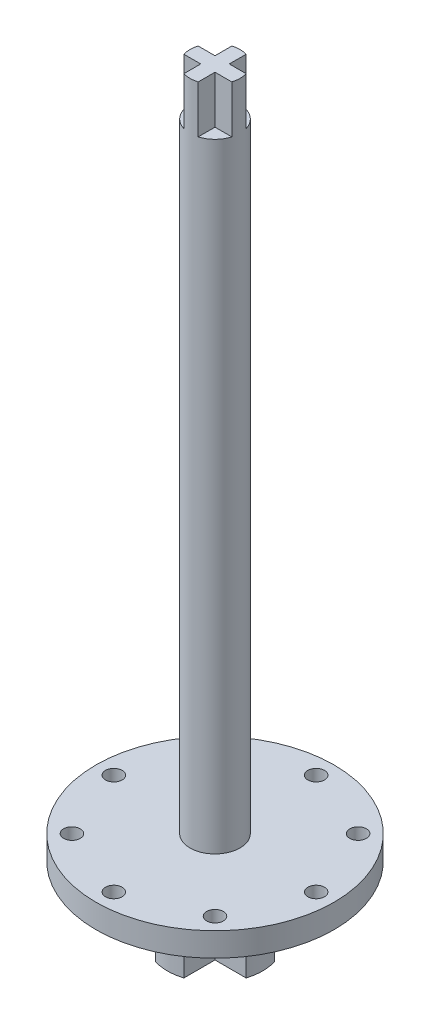
ISO-10303-21;
HEADER;
FILE_DESCRIPTION(('STEP AP214'),'2;1');
FILE_NAME('part.step','',(''),(''),'','','');
FILE_SCHEMA(('AUTOMOTIVE_DESIGN { 1 0 10303 214 1 1 1 1 }'));
ENDSEC;
DATA;
#1=APPLICATION_CONTEXT('core data for automotive mechanical design processes');
#2=APPLICATION_PROTOCOL_DEFINITION('international standard','automotive_design',2000,#1);
#3=PRODUCT_CONTEXT('',#1,'mechanical');
#4=PRODUCT('Part','Part','',(#3));
#5=PRODUCT_RELATED_PRODUCT_CATEGORY('part','',(#4));
#6=PRODUCT_DEFINITION_FORMATION('','',#4);
#7=PRODUCT_DEFINITION_CONTEXT('part definition',#1,'design');
#8=PRODUCT_DEFINITION('design','',#6,#7);
#9=PRODUCT_DEFINITION_SHAPE('','',#8);
#10=(LENGTH_UNIT() NAMED_UNIT(*) SI_UNIT(.MILLI.,.METRE.));
#11=(NAMED_UNIT(*) PLANE_ANGLE_UNIT() SI_UNIT($,.RADIAN.));
#12=(NAMED_UNIT(*) SI_UNIT($,.STERADIAN.) SOLID_ANGLE_UNIT());
#13=UNCERTAINTY_MEASURE_WITH_UNIT(LENGTH_MEASURE(1.E-05),#10,'distance_accuracy_value','');
#14=(GEOMETRIC_REPRESENTATION_CONTEXT(3) GLOBAL_UNCERTAINTY_ASSIGNED_CONTEXT((#13)) GLOBAL_UNIT_ASSIGNED_CONTEXT((#10,
#11,#12)) REPRESENTATION_CONTEXT('',''));
#15=CARTESIAN_POINT('',(0.,0.,0.));
#16=DIRECTION('',(0.,0.,1.));
#17=DIRECTION('',(1.,0.,0.));
#18=AXIS2_PLACEMENT_3D('',#15,#16,#17);
#19=CARTESIAN_POINT('',(0.,80.,5.25));
#20=DIRECTION('',(0.,1.,0.));
#21=DIRECTION('',(0.,0.,1.));
#22=AXIS2_PLACEMENT_3D('',#19,#20,#21);
#23=PLANE('',#22);
#24=DIRECTION('',(0.,0.,1.));
#25=VECTOR('',#24,1.);
#26=CARTESIAN_POINT('',(-1.5,80.,-5.03115294937453));
#27=LINE('',#26,#25);
#28=CARTESIAN_POINT('',(-1.5,80.,-5.03115294937453));
#29=VERTEX_POINT('',#28);
#30=CARTESIAN_POINT('',(-1.5,80.,-1.50000000000002));
#31=VERTEX_POINT('',#30);
#32=EDGE_CURVE('E372',#29,#31,#27,.T.);
#33=ORIENTED_EDGE('',*,*,#32,.T.);
#34=DIRECTION('',(-1.,0.,0.));
#35=VECTOR('',#34,1.);
#36=CARTESIAN_POINT('',(-1.5,80.,-1.50000000000002));
#37=LINE('',#36,#35);
#38=CARTESIAN_POINT('',(-5.03115294937451,80.,-1.50000000000002));
#39=VERTEX_POINT('',#38);
#40=EDGE_CURVE('E378',#31,#39,#37,.T.);
#41=ORIENTED_EDGE('',*,*,#40,.T.);
#42=CARTESIAN_POINT('',(0.,80.,0.));
#43=DIRECTION('',(0.,1.,0.));
#44=DIRECTION('',(0.,0.,1.));
#45=AXIS2_PLACEMENT_3D('',#42,#43,#44);
#46=CIRCLE('',#45,5.25);
#47=CARTESIAN_POINT('',(-5.03115294937455,80.,1.49999999999995));
#48=VERTEX_POINT('',#47);
#49=EDGE_CURVE('E232',#39,#48,#46,.T.);
#50=ORIENTED_EDGE('',*,*,#49,.T.);
#51=DIRECTION('',(1.,0.,0.));
#52=VECTOR('',#51,1.);
#53=CARTESIAN_POINT('',(0.,80.,1.5));
#54=LINE('',#53,#52);
#55=CARTESIAN_POINT('',(-1.50000000000004,80.,1.49999999999998));
#56=VERTEX_POINT('',#55);
#57=EDGE_CURVE('E359',#48,#56,#54,.T.);
#58=ORIENTED_EDGE('',*,*,#57,.T.);
#59=DIRECTION('',(0.,0.,1.));
#60=VECTOR('',#59,1.);
#61=CARTESIAN_POINT('',(-1.50000000000002,80.,0.));
#62=LINE('',#61,#60);
#63=CARTESIAN_POINT('',(-1.50000000000008,80.,5.03115294937451));
#64=VERTEX_POINT('',#63);
#65=EDGE_CURVE('E217',#56,#64,#62,.T.);
#66=ORIENTED_EDGE('',*,*,#65,.T.);
#67=CARTESIAN_POINT('',(1.49999999999996,80.,5.03115294937454));
#68=VERTEX_POINT('',#67);
#69=EDGE_CURVE('E227',#64,#68,#46,.T.);
#70=ORIENTED_EDGE('',*,*,#69,.T.);
#71=DIRECTION('',(0.,0.,-1.));
#72=VECTOR('',#71,1.);
#73=CARTESIAN_POINT('',(1.5,80.,0.));
#74=LINE('',#73,#72);
#75=CARTESIAN_POINT('',(1.49999999999999,80.,1.50000000000003));
#76=VERTEX_POINT('',#75);
#77=EDGE_CURVE('E216',#68,#76,#74,.T.);
#78=ORIENTED_EDGE('',*,*,#77,.T.);
#79=DIRECTION('',(1.,0.,0.));
#80=VECTOR('',#79,1.);
#81=CARTESIAN_POINT('',(0.,80.,1.50000000000002));
#82=LINE('',#81,#80);
#83=CARTESIAN_POINT('',(5.03115294937451,80.,1.50000000000006));
#84=VERTEX_POINT('',#83);
#85=EDGE_CURVE('E199',#76,#84,#82,.T.);
#86=ORIENTED_EDGE('',*,*,#85,.T.);
#87=CARTESIAN_POINT('',(5.03115294937454,80.,-1.49999999999998));
#88=VERTEX_POINT('',#87);
#89=EDGE_CURVE('E214',#84,#88,#46,.T.);
#90=ORIENTED_EDGE('',*,*,#89,.T.);
#91=DIRECTION('',(-1.,0.,0.));
#92=VECTOR('',#91,1.);
#93=CARTESIAN_POINT('',(0.,80.,-1.5));
#94=LINE('',#93,#92);
#95=CARTESIAN_POINT('',(1.50000000000003,80.,-1.49999999999999));
#96=VERTEX_POINT('',#95);
#97=EDGE_CURVE('E391',#88,#96,#94,.T.);
#98=ORIENTED_EDGE('',*,*,#97,.T.);
#99=DIRECTION('',(0.,0.,-1.));
#100=VECTOR('',#99,1.);
#101=CARTESIAN_POINT('',(1.50000000000002,80.,0.));
#102=LINE('',#101,#100);
#103=CARTESIAN_POINT('',(1.50000000000004,80.,-5.03115294937452));
#104=VERTEX_POINT('',#103);
#105=EDGE_CURVE('E208',#96,#104,#102,.T.);
#106=ORIENTED_EDGE('',*,*,#105,.T.);
#107=EDGE_CURVE('E225',#104,#29,#46,.T.);
#108=ORIENTED_EDGE('',*,*,#107,.T.);
#109=EDGE_LOOP('',(#33,#41,#50,#58,#66,#70,#78,#86,#90,#98,#106,#108));
#110=FACE_BOUND('',#109,.T.);
#111=ADVANCED_FACE('F33',(#110),#23,.T.);
#112=CARTESIAN_POINT('',(0.,49.9145299145299,0.));
#113=DIRECTION('',(0.,1.,0.));
#114=DIRECTION('',(0.,0.,1.));
#115=AXIS2_PLACEMENT_3D('',#112,#113,#114);
#116=CYLINDRICAL_SURFACE('',#115,5.25);
#117=CARTESIAN_POINT('',(0.,-60.,0.));
#118=DIRECTION('',(0.,1.,0.));
#119=DIRECTION('',(0.,0.,1.));
#120=AXIS2_PLACEMENT_3D('',#117,#118,#119);
#121=CIRCLE('',#120,5.24999999999999);
#122=CARTESIAN_POINT('',(0.,-60.,5.24999999999999));
#123=VERTEX_POINT('',#122);
#124=EDGE_CURVE('E224',#123,#123,#121,.T.);
#125=ORIENTED_EDGE('',*,*,#124,.T.);
#126=EDGE_LOOP('',(#125));
#127=FACE_BOUND('',#126,.T.);
#128=ORIENTED_EDGE('',*,*,#49,.F.);
#129=DIRECTION('',(0.,1.,0.));
#130=VECTOR('',#129,1.);
#131=CARTESIAN_POINT('',(-5.03115294937451,70.,-1.50000000000002));
#132=LINE('',#131,#130);
#133=CARTESIAN_POINT('',(-5.03115294937451,70.,-1.50000000000002));
#134=VERTEX_POINT('',#133);
#135=EDGE_CURVE('E387',#134,#39,#132,.T.);
#136=ORIENTED_EDGE('',*,*,#135,.F.);
#137=CARTESIAN_POINT('',(0.,70.,0.));
#138=DIRECTION('',(0.,-1.,0.));
#139=DIRECTION('',(0.,0.,-1.));
#140=AXIS2_PLACEMENT_3D('',#137,#138,#139);
#141=CIRCLE('',#140,5.24999999999999);
#142=CARTESIAN_POINT('',(-1.5,70.,-5.03115294937452));
#143=VERTEX_POINT('',#142);
#144=EDGE_CURVE('E373',#134,#143,#141,.T.);
#145=ORIENTED_EDGE('',*,*,#144,.T.);
#146=DIRECTION('',(0.,1.,0.));
#147=VECTOR('',#146,1.);
#148=CARTESIAN_POINT('',(-1.5,70.,-5.03115294937453));
#149=LINE('',#148,#147);
#150=EDGE_CURVE('E384',#143,#29,#149,.T.);
#151=ORIENTED_EDGE('',*,*,#150,.T.);
#152=ORIENTED_EDGE('',*,*,#107,.F.);
#153=DIRECTION('',(0.,1.,0.));
#154=VECTOR('',#153,1.);
#155=CARTESIAN_POINT('',(1.50000000000004,70.,-5.03115294937452));
#156=LINE('',#155,#154);
#157=CARTESIAN_POINT('',(1.50000000000004,70.,-5.03115294937452));
#158=VERTEX_POINT('',#157);
#159=EDGE_CURVE('E381',#158,#104,#156,.T.);
#160=ORIENTED_EDGE('',*,*,#159,.F.);
#161=CARTESIAN_POINT('',(0.,70.,0.));
#162=DIRECTION('',(0.,1.,0.));
#163=DIRECTION('',(0.,0.,1.));
#164=AXIS2_PLACEMENT_3D('',#161,#162,#163);
#165=CIRCLE('',#164,5.25);
#166=CARTESIAN_POINT('',(5.03115294937453,70.,-1.49999999999998));
#167=VERTEX_POINT('',#166);
#168=EDGE_CURVE('E393',#167,#158,#165,.T.);
#169=ORIENTED_EDGE('',*,*,#168,.F.);
#170=DIRECTION('',(0.,1.,0.));
#171=VECTOR('',#170,1.);
#172=CARTESIAN_POINT('',(5.03115294937454,70.,-1.49999999999998));
#173=LINE('',#172,#171);
#174=EDGE_CURVE('E223',#167,#88,#173,.T.);
#175=ORIENTED_EDGE('',*,*,#174,.T.);
#176=ORIENTED_EDGE('',*,*,#89,.F.);
#177=DIRECTION('',(0.,1.,0.));
#178=VECTOR('',#177,1.);
#179=CARTESIAN_POINT('',(5.03115294937451,70.,1.50000000000006));
#180=LINE('',#179,#178);
#181=CARTESIAN_POINT('',(5.03115294937451,70.,1.50000000000006));
#182=VERTEX_POINT('',#181);
#183=EDGE_CURVE('E195',#182,#84,#180,.T.);
#184=ORIENTED_EDGE('',*,*,#183,.F.);
#185=CARTESIAN_POINT('',(0.,70.,0.));
#186=DIRECTION('',(0.,1.,0.));
#187=DIRECTION('',(0.,0.,1.));
#188=AXIS2_PLACEMENT_3D('',#185,#186,#187);
#189=CIRCLE('',#188,5.25);
#190=CARTESIAN_POINT('',(1.49999999999996,70.,5.03115294937453));
#191=VERTEX_POINT('',#190);
#192=EDGE_CURVE('E405',#191,#182,#189,.T.);
#193=ORIENTED_EDGE('',*,*,#192,.F.);
#194=DIRECTION('',(0.,1.,0.));
#195=VECTOR('',#194,1.);
#196=CARTESIAN_POINT('',(1.49999999999996,70.,5.03115294937454));
#197=LINE('',#196,#195);
#198=EDGE_CURVE('E207',#191,#68,#197,.T.);
#199=ORIENTED_EDGE('',*,*,#198,.T.);
#200=ORIENTED_EDGE('',*,*,#69,.F.);
#201=DIRECTION('',(0.,1.,0.));
#202=VECTOR('',#201,1.);
#203=CARTESIAN_POINT('',(-1.50000000000008,70.,5.03115294937451));
#204=LINE('',#203,#202);
#205=CARTESIAN_POINT('',(-1.50000000000008,70.,5.03115294937451));
#206=VERTEX_POINT('',#205);
#207=EDGE_CURVE('E320',#206,#64,#204,.T.);
#208=ORIENTED_EDGE('',*,*,#207,.F.);
#209=CARTESIAN_POINT('',(0.,70.,0.));
#210=DIRECTION('',(0.,1.,0.));
#211=DIRECTION('',(0.,0.,1.));
#212=AXIS2_PLACEMENT_3D('',#209,#210,#211);
#213=CIRCLE('',#212,5.25);
#214=CARTESIAN_POINT('',(-5.03115294937454,70.,1.49999999999995));
#215=VERTEX_POINT('',#214);
#216=EDGE_CURVE('E355',#215,#206,#213,.T.);
#217=ORIENTED_EDGE('',*,*,#216,.F.);
#218=DIRECTION('',(0.,1.,0.));
#219=VECTOR('',#218,1.);
#220=CARTESIAN_POINT('',(-5.03115294937455,70.,1.49999999999995));
#221=LINE('',#220,#219);
#222=EDGE_CURVE('E354',#215,#48,#221,.T.);
#223=ORIENTED_EDGE('',*,*,#222,.T.);
#224=EDGE_LOOP('',(#128,#136,#145,#151,#152,#160,#169,#175,#176,#184,#193,#199,#200,#208,#217,#223));
#225=FACE_BOUND('',#224,.T.);
#226=ADVANCED_FACE('F221',(#127,#225),#116,.T.);
#227=CARTESIAN_POINT('',(0.,49.9145299145299,0.));
#228=DIRECTION('',(0.,1.,0.));
#229=DIRECTION('',(0.,0.,1.));
#230=AXIS2_PLACEMENT_3D('',#227,#228,#229);
#231=CYLINDRICAL_SURFACE('',#230,9.99999999999998);
#232=DIRECTION('',(0.,-1.,0.));
#233=VECTOR('',#232,1.);
#234=CARTESIAN_POINT('',(3.,-55.7519031238873,9.53939201416943));
#235=LINE('',#234,#233);
#236=CARTESIAN_POINT('',(3.,-65.,9.53939201416943));
#237=VERTEX_POINT('',#236);
#238=CARTESIAN_POINT('',(3.,-80.,9.53939201416943));
#239=VERTEX_POINT('',#238);
#240=EDGE_CURVE('E314',#237,#239,#235,.T.);
#241=ORIENTED_EDGE('',*,*,#240,.F.);
#242=CARTESIAN_POINT('',(0.,-65.,0.));
#243=DIRECTION('',(0.,1.,0.));
#244=DIRECTION('',(0.,0.,1.));
#245=AXIS2_PLACEMENT_3D('',#242,#243,#244);
#246=CIRCLE('',#245,9.99999999999998);
#247=CARTESIAN_POINT('',(-3.,-65.,9.53939201416944));
#248=VERTEX_POINT('',#247);
#249=EDGE_CURVE('E505',#248,#237,#246,.T.);
#250=ORIENTED_EDGE('',*,*,#249,.F.);
#251=DIRECTION('',(0.,-1.,0.));
#252=VECTOR('',#251,1.);
#253=CARTESIAN_POINT('',(-3.,-55.7519031238873,9.53939201416944));
#254=LINE('',#253,#252);
#255=CARTESIAN_POINT('',(-3.,-80.,9.53939201416944));
#256=VERTEX_POINT('',#255);
#257=EDGE_CURVE('E295',#248,#256,#254,.T.);
#258=ORIENTED_EDGE('',*,*,#257,.T.);
#259=CARTESIAN_POINT('',(0.,-80.,0.));
#260=DIRECTION('',(0.,1.,0.));
#261=DIRECTION('',(0.,0.,1.));
#262=AXIS2_PLACEMENT_3D('',#259,#260,#261);
#263=CIRCLE('',#262,9.99999999999999);
#264=EDGE_CURVE('E36',#256,#239,#263,.T.);
#265=ORIENTED_EDGE('',*,*,#264,.T.);
#266=EDGE_LOOP('',(#241,#250,#258,#265));
#267=FACE_BOUND('',#266,.T.);
#268=ADVANCED_FACE('F454',(#267),#231,.T.);
#269=DIRECTION('',(0.,-1.,0.));
#270=VECTOR('',#269,1.);
#271=CARTESIAN_POINT('',(3.,-55.7519031238873,-9.53939201416944));
#272=LINE('',#271,#270);
#273=CARTESIAN_POINT('',(3.,-65.,-9.53939201416944));
#274=VERTEX_POINT('',#273);
#275=CARTESIAN_POINT('',(3.,-80.,-9.53939201416944));
#276=VERTEX_POINT('',#275);
#277=EDGE_CURVE('E322',#274,#276,#272,.T.);
#278=ORIENTED_EDGE('',*,*,#277,.T.);
#279=CARTESIAN_POINT('',(-3.,-80.,-9.53939201416946));
#280=VERTEX_POINT('',#279);
#281=EDGE_CURVE('E41',#276,#280,#263,.T.);
#282=ORIENTED_EDGE('',*,*,#281,.T.);
#283=DIRECTION('',(0.,-1.,0.));
#284=VECTOR('',#283,1.);
#285=CARTESIAN_POINT('',(-3.,-55.7519031238873,-9.53939201416946));
#286=LINE('',#285,#284);
#287=CARTESIAN_POINT('',(-3.,-65.,-9.53939201416946));
#288=VERTEX_POINT('',#287);
#289=EDGE_CURVE('E346',#288,#280,#286,.T.);
#290=ORIENTED_EDGE('',*,*,#289,.F.);
#291=EDGE_CURVE('E504',#274,#288,#246,.T.);
#292=ORIENTED_EDGE('',*,*,#291,.F.);
#293=EDGE_LOOP('',(#278,#282,#290,#292));
#294=FACE_BOUND('',#293,.T.);
#295=ADVANCED_FACE('F460',(#294),#231,.T.);
#296=DIRECTION('',(0.,-1.,0.));
#297=VECTOR('',#296,1.);
#298=CARTESIAN_POINT('',(9.53939201416945,-55.7519031238873,3.));
#299=LINE('',#298,#297);
#300=CARTESIAN_POINT('',(9.53939201416944,-65.,3.));
#301=VERTEX_POINT('',#300);
#302=CARTESIAN_POINT('',(9.53939201416945,-80.,3.));
#303=VERTEX_POINT('',#302);
#304=EDGE_CURVE('E310',#301,#303,#299,.T.);
#305=ORIENTED_EDGE('',*,*,#304,.T.);
#306=CARTESIAN_POINT('',(9.53939201416945,-80.,-3.));
#307=VERTEX_POINT('',#306);
#308=EDGE_CURVE('E11',#303,#307,#263,.T.);
#309=ORIENTED_EDGE('',*,*,#308,.T.);
#310=DIRECTION('',(0.,-1.,0.));
#311=VECTOR('',#310,1.);
#312=CARTESIAN_POINT('',(9.53939201416945,-55.7519031238873,-3.));
#313=LINE('',#312,#311);
#314=CARTESIAN_POINT('',(9.53939201416945,-65.,-3.));
#315=VERTEX_POINT('',#314);
#316=EDGE_CURVE('E325',#315,#307,#313,.T.);
#317=ORIENTED_EDGE('',*,*,#316,.F.);
#318=EDGE_CURVE('E501',#301,#315,#246,.T.);
#319=ORIENTED_EDGE('',*,*,#318,.F.);
#320=EDGE_LOOP('',(#305,#309,#317,#319));
#321=FACE_BOUND('',#320,.T.);
#322=ADVANCED_FACE('F482',(#321),#231,.T.);
#323=CARTESIAN_POINT('',(0.,-80.,9.99999999999999));
#324=DIRECTION('',(0.,-1.,0.));
#325=DIRECTION('',(0.,0.,-1.));
#326=AXIS2_PLACEMENT_3D('',#323,#324,#325);
#327=PLANE('',#326);
#328=DIRECTION('',(0.,0.,-1.));
#329=VECTOR('',#328,1.);
#330=CARTESIAN_POINT('',(3.,-80.,9.53939201416944));
#331=LINE('',#330,#329);
#332=CARTESIAN_POINT('',(3.,-80.,3.));
#333=VERTEX_POINT('',#332);
#334=EDGE_CURVE('E317',#239,#333,#331,.T.);
#335=ORIENTED_EDGE('',*,*,#334,.F.);
#336=ORIENTED_EDGE('',*,*,#264,.F.);
#337=DIRECTION('',(0.,0.,1.));
#338=VECTOR('',#337,1.);
#339=CARTESIAN_POINT('',(-3.,-80.,9.53939201416944));
#340=LINE('',#339,#338);
#341=CARTESIAN_POINT('',(-3.,-80.,3.));
#342=VERTEX_POINT('',#341);
#343=EDGE_CURVE('E293',#342,#256,#340,.T.);
#344=ORIENTED_EDGE('',*,*,#343,.F.);
#345=DIRECTION('',(1.,0.,0.));
#346=VECTOR('',#345,1.);
#347=CARTESIAN_POINT('',(-3.,-80.,3.));
#348=LINE('',#347,#346);
#349=CARTESIAN_POINT('',(-9.53939201416944,-80.,3.));
#350=VERTEX_POINT('',#349);
#351=EDGE_CURVE('E299',#350,#342,#348,.T.);
#352=ORIENTED_EDGE('',*,*,#351,.F.);
#353=CARTESIAN_POINT('',(-9.53939201416944,-80.,-3.));
#354=VERTEX_POINT('',#353);
#355=EDGE_CURVE('E500',#354,#350,#263,.T.);
#356=ORIENTED_EDGE('',*,*,#355,.F.);
#357=DIRECTION('',(-1.,0.,0.));
#358=VECTOR('',#357,1.);
#359=CARTESIAN_POINT('',(-3.,-80.,-3.));
#360=LINE('',#359,#358);
#361=CARTESIAN_POINT('',(-3.,-80.,-3.));
#362=VERTEX_POINT('',#361);
#363=EDGE_CURVE('E343',#362,#354,#360,.T.);
#364=ORIENTED_EDGE('',*,*,#363,.F.);
#365=DIRECTION('',(0.,0.,1.));
#366=VECTOR('',#365,1.);
#367=CARTESIAN_POINT('',(-2.99999999999999,-80.,-9.53939201416944));
#368=LINE('',#367,#366);
#369=EDGE_CURVE('E336',#280,#362,#368,.T.);
#370=ORIENTED_EDGE('',*,*,#369,.F.);
#371=ORIENTED_EDGE('',*,*,#281,.F.);
#372=DIRECTION('',(0.,0.,-1.));
#373=VECTOR('',#372,1.);
#374=CARTESIAN_POINT('',(3.,-80.,-9.53939201416944));
#375=LINE('',#374,#373);
#376=CARTESIAN_POINT('',(3.,-80.,-3.));
#377=VERTEX_POINT('',#376);
#378=EDGE_CURVE('E306',#377,#276,#375,.T.);
#379=ORIENTED_EDGE('',*,*,#378,.F.);
#380=DIRECTION('',(-1.,0.,0.));
#381=VECTOR('',#380,1.);
#382=CARTESIAN_POINT('',(3.,-80.,-3.));
#383=LINE('',#382,#381);
#384=EDGE_CURVE('E326',#307,#377,#383,.T.);
#385=ORIENTED_EDGE('',*,*,#384,.F.);
#386=ORIENTED_EDGE('',*,*,#308,.F.);
#387=DIRECTION('',(1.,0.,0.));
#388=VECTOR('',#387,1.);
#389=CARTESIAN_POINT('',(3.,-80.,3.));
#390=LINE('',#389,#388);
#391=EDGE_CURVE('E311',#333,#303,#390,.T.);
#392=ORIENTED_EDGE('',*,*,#391,.F.);
#393=EDGE_LOOP('',(#335,#336,#344,#352,#356,#364,#370,#371,#379,#385,#386,#392));
#394=FACE_BOUND('',#393,.T.);
#395=ADVANCED_FACE('F480',(#394),#327,.T.);
#396=DIRECTION('',(0.,-1.,0.));
#397=VECTOR('',#396,1.);
#398=CARTESIAN_POINT('',(-9.53939201416944,-55.7519031238873,-3.));
#399=LINE('',#398,#397);
#400=CARTESIAN_POINT('',(-9.53939201416944,-65.,-3.00000000000001));
#401=VERTEX_POINT('',#400);
#402=EDGE_CURVE('E342',#401,#354,#399,.T.);
#403=ORIENTED_EDGE('',*,*,#402,.T.);
#404=ORIENTED_EDGE('',*,*,#355,.T.);
#405=DIRECTION('',(0.,-1.,0.));
#406=VECTOR('',#405,1.);
#407=CARTESIAN_POINT('',(-9.53939201416944,-55.7519031238873,3.));
#408=LINE('',#407,#406);
#409=CARTESIAN_POINT('',(-9.53939201416944,-65.,3.));
#410=VERTEX_POINT('',#409);
#411=EDGE_CURVE('E290',#410,#350,#408,.T.);
#412=ORIENTED_EDGE('',*,*,#411,.F.);
#413=EDGE_CURVE('E510',#401,#410,#246,.T.);
#414=ORIENTED_EDGE('',*,*,#413,.F.);
#415=EDGE_LOOP('',(#403,#404,#412,#414));
#416=FACE_BOUND('',#415,.T.);
#417=ADVANCED_FACE('F463',(#416),#231,.T.);
#418=CARTESIAN_POINT('',(0.,-65.,25.));
#419=DIRECTION('',(0.,-1.,0.));
#420=DIRECTION('',(0.,0.,-1.));
#421=AXIS2_PLACEMENT_3D('',#418,#419,#420);
#422=PLANE('',#421);
#423=CARTESIAN_POINT('',(0.,-65.,21.25));
#424=DIRECTION('',(0.,-1.,0.));
#425=DIRECTION('',(0.,0.,-1.));
#426=AXIS2_PLACEMENT_3D('',#423,#424,#425);
#427=CIRCLE('',#426,1.75);
#428=CARTESIAN_POINT('',(0.,-65.,19.5));
#429=VERTEX_POINT('',#428);
#430=EDGE_CURVE('E234',#429,#429,#427,.T.);
#431=ORIENTED_EDGE('',*,*,#430,.F.);
#432=EDGE_LOOP('',(#431));
#433=FACE_BOUND('',#432,.T.);
#434=CARTESIAN_POINT('',(-15.0260191002142,-65.,15.0260191002141));
#435=DIRECTION('',(0.,-1.,0.));
#436=DIRECTION('',(0.,0.,-1.));
#437=AXIS2_PLACEMENT_3D('',#434,#435,#436);
#438=CIRCLE('',#437,1.75);
#439=CARTESIAN_POINT('',(-15.0260191002142,-65.,13.2760191002141));
#440=VERTEX_POINT('',#439);
#441=EDGE_CURVE('E239',#440,#440,#438,.T.);
#442=ORIENTED_EDGE('',*,*,#441,.F.);
#443=EDGE_LOOP('',(#442));
#444=FACE_BOUND('',#443,.T.);
#445=CARTESIAN_POINT('',(-21.25,-65.,0.));
#446=DIRECTION('',(0.,-1.,0.));
#447=DIRECTION('',(0.,0.,-1.));
#448=AXIS2_PLACEMENT_3D('',#445,#446,#447);
#449=CIRCLE('',#448,1.75);
#450=CARTESIAN_POINT('',(-21.25,-65.,-1.75));
#451=VERTEX_POINT('',#450);
#452=EDGE_CURVE('E243',#451,#451,#449,.T.);
#453=ORIENTED_EDGE('',*,*,#452,.F.);
#454=EDGE_LOOP('',(#453));
#455=FACE_BOUND('',#454,.T.);
#456=CARTESIAN_POINT('',(-15.0260191002142,-65.,-15.0260191002141));
#457=DIRECTION('',(0.,-1.,0.));
#458=DIRECTION('',(0.,0.,-1.));
#459=AXIS2_PLACEMENT_3D('',#456,#457,#458);
#460=CIRCLE('',#459,1.75);
#461=CARTESIAN_POINT('',(-15.0260191002142,-65.,-16.7760191002141));
#462=VERTEX_POINT('',#461);
#463=EDGE_CURVE('E248',#462,#462,#460,.T.);
#464=ORIENTED_EDGE('',*,*,#463,.F.);
#465=EDGE_LOOP('',(#464));
#466=FACE_BOUND('',#465,.T.);
#467=CARTESIAN_POINT('',(0.,-65.,-21.25));
#468=DIRECTION('',(0.,-1.,0.));
#469=DIRECTION('',(0.,0.,-1.));
#470=AXIS2_PLACEMENT_3D('',#467,#468,#469);
#471=CIRCLE('',#470,1.75);
#472=CARTESIAN_POINT('',(0.,-65.,-23.));
#473=VERTEX_POINT('',#472);
#474=EDGE_CURVE('E251',#473,#473,#471,.T.);
#475=ORIENTED_EDGE('',*,*,#474,.F.);
#476=EDGE_LOOP('',(#475));
#477=FACE_BOUND('',#476,.T.);
#478=CARTESIAN_POINT('',(15.0260191002142,-65.,-15.0260191002141));
#479=DIRECTION('',(0.,-1.,0.));
#480=DIRECTION('',(0.,0.,-1.));
#481=AXIS2_PLACEMENT_3D('',#478,#479,#480);
#482=CIRCLE('',#481,1.75);
#483=CARTESIAN_POINT('',(15.0260191002142,-65.,-16.7760191002141));
#484=VERTEX_POINT('',#483);
#485=EDGE_CURVE('E254',#484,#484,#482,.T.);
#486=ORIENTED_EDGE('',*,*,#485,.F.);
#487=EDGE_LOOP('',(#486));
#488=FACE_BOUND('',#487,.T.);
#489=CARTESIAN_POINT('',(21.25,-65.,0.));
#490=DIRECTION('',(0.,-1.,0.));
#491=DIRECTION('',(0.,0.,-1.));
#492=AXIS2_PLACEMENT_3D('',#489,#490,#491);
#493=CIRCLE('',#492,1.75);
#494=CARTESIAN_POINT('',(21.25,-65.,-1.75));
#495=VERTEX_POINT('',#494);
#496=EDGE_CURVE('E257',#495,#495,#493,.T.);
#497=ORIENTED_EDGE('',*,*,#496,.F.);
#498=EDGE_LOOP('',(#497));
#499=FACE_BOUND('',#498,.T.);
#500=CARTESIAN_POINT('',(15.0260191002142,-65.,15.0260191002141));
#501=DIRECTION('',(0.,-1.,0.));
#502=DIRECTION('',(0.,0.,-1.));
#503=AXIS2_PLACEMENT_3D('',#500,#501,#502);
#504=CIRCLE('',#503,1.75);
#505=CARTESIAN_POINT('',(15.0260191002142,-65.,13.2760191002141));
#506=VERTEX_POINT('',#505);
#507=EDGE_CURVE('E260',#506,#506,#504,.T.);
#508=ORIENTED_EDGE('',*,*,#507,.F.);
#509=EDGE_LOOP('',(#508));
#510=FACE_BOUND('',#509,.T.);
#511=ORIENTED_EDGE('',*,*,#249,.T.);
#512=DIRECTION('',(0.,0.,1.));
#513=VECTOR('',#512,1.);
#514=CARTESIAN_POINT('',(3.,-65.,9.53939201416944));
#515=LINE('',#514,#513);
#516=CARTESIAN_POINT('',(3.,-65.,3.));
#517=VERTEX_POINT('',#516);
#518=EDGE_CURVE('E307',#517,#237,#515,.T.);
#519=ORIENTED_EDGE('',*,*,#518,.F.);
#520=DIRECTION('',(-1.,0.,0.));
#521=VECTOR('',#520,1.);
#522=CARTESIAN_POINT('',(3.,-65.,3.));
#523=LINE('',#522,#521);
#524=EDGE_CURVE('E304',#301,#517,#523,.T.);
#525=ORIENTED_EDGE('',*,*,#524,.F.);
#526=ORIENTED_EDGE('',*,*,#318,.T.);
#527=DIRECTION('',(1.,0.,0.));
#528=VECTOR('',#527,1.);
#529=CARTESIAN_POINT('',(3.,-65.,-3.));
#530=LINE('',#529,#528);
#531=CARTESIAN_POINT('',(3.,-65.,-3.));
#532=VERTEX_POINT('',#531);
#533=EDGE_CURVE('E330',#532,#315,#530,.T.);
#534=ORIENTED_EDGE('',*,*,#533,.F.);
#535=DIRECTION('',(0.,0.,1.));
#536=VECTOR('',#535,1.);
#537=CARTESIAN_POINT('',(3.,-65.,-9.53939201416944));
#538=LINE('',#537,#536);
#539=EDGE_CURVE('E334',#274,#532,#538,.T.);
#540=ORIENTED_EDGE('',*,*,#539,.F.);
#541=ORIENTED_EDGE('',*,*,#291,.T.);
#542=DIRECTION('',(0.,0.,-1.));
#543=VECTOR('',#542,1.);
#544=CARTESIAN_POINT('',(-2.99999999999999,-65.,-9.53939201416944));
#545=LINE('',#544,#543);
#546=CARTESIAN_POINT('',(-3.,-65.,-3.));
#547=VERTEX_POINT('',#546);
#548=EDGE_CURVE('E339',#547,#288,#545,.T.);
#549=ORIENTED_EDGE('',*,*,#548,.F.);
#550=DIRECTION('',(1.,0.,0.));
#551=VECTOR('',#550,1.);
#552=CARTESIAN_POINT('',(-3.,-65.,-3.));
#553=LINE('',#552,#551);
#554=EDGE_CURVE('E302',#401,#547,#553,.T.);
#555=ORIENTED_EDGE('',*,*,#554,.F.);
#556=ORIENTED_EDGE('',*,*,#413,.T.);
#557=DIRECTION('',(-1.,0.,0.));
#558=VECTOR('',#557,1.);
#559=CARTESIAN_POINT('',(-3.,-65.,3.));
#560=LINE('',#559,#558);
#561=CARTESIAN_POINT('',(-3.,-65.,3.));
#562=VERTEX_POINT('',#561);
#563=EDGE_CURVE('E268',#562,#410,#560,.T.);
#564=ORIENTED_EDGE('',*,*,#563,.F.);
#565=DIRECTION('',(0.,0.,-1.));
#566=VECTOR('',#565,1.);
#567=CARTESIAN_POINT('',(-3.,-65.,9.53939201416944));
#568=LINE('',#567,#566);
#569=EDGE_CURVE('E289',#248,#562,#568,.T.);
#570=ORIENTED_EDGE('',*,*,#569,.F.);
#571=EDGE_LOOP('',(#511,#519,#525,#526,#534,#540,#541,#549,#555,#556,#564,#570));
#572=FACE_BOUND('',#571,.T.);
#573=CARTESIAN_POINT('',(0.,-65.,0.));
#574=DIRECTION('',(0.,1.,0.));
#575=DIRECTION('',(0.,0.,1.));
#576=AXIS2_PLACEMENT_3D('',#573,#574,#575);
#577=CIRCLE('',#576,25.);
#578=CARTESIAN_POINT('',(0.,-65.,25.));
#579=VERTEX_POINT('',#578);
#580=EDGE_CURVE('E512',#579,#579,#577,.T.);
#581=ORIENTED_EDGE('',*,*,#580,.F.);
#582=EDGE_LOOP('',(#581));
#583=FACE_BOUND('',#582,.T.);
#584=ADVANCED_FACE('F475',(#433,#444,#455,#466,#477,#488,#499,#510,#572,#583),#422,.T.);
#585=CARTESIAN_POINT('',(0.,49.9145299145299,0.));
#586=DIRECTION('',(0.,1.,0.));
#587=DIRECTION('',(0.,0.,1.));
#588=AXIS2_PLACEMENT_3D('',#585,#586,#587);
#589=CYLINDRICAL_SURFACE('',#588,25.);
#590=ORIENTED_EDGE('',*,*,#580,.T.);
#591=EDGE_LOOP('',(#590));
#592=FACE_BOUND('',#591,.T.);
#593=CARTESIAN_POINT('',(0.,-60.,0.));
#594=DIRECTION('',(0.,1.,0.));
#595=DIRECTION('',(0.,0.,1.));
#596=AXIS2_PLACEMENT_3D('',#593,#594,#595);
#597=CIRCLE('',#596,25.);
#598=CARTESIAN_POINT('',(0.,-60.,25.));
#599=VERTEX_POINT('',#598);
#600=EDGE_CURVE('E229',#599,#599,#597,.T.);
#601=ORIENTED_EDGE('',*,*,#600,.F.);
#602=EDGE_LOOP('',(#601));
#603=FACE_BOUND('',#602,.T.);
#604=ADVANCED_FACE('F471',(#592,#603),#589,.T.);
#605=CARTESIAN_POINT('',(0.,-60.,5.24999999999999));
#606=DIRECTION('',(0.,1.,0.));
#607=DIRECTION('',(0.,0.,1.));
#608=AXIS2_PLACEMENT_3D('',#605,#606,#607);
#609=PLANE('',#608);
#610=CARTESIAN_POINT('',(0.,-60.,21.25));
#611=DIRECTION('',(0.,1.,0.));
#612=DIRECTION('',(0.,0.,1.));
#613=AXIS2_PLACEMENT_3D('',#610,#611,#612);
#614=CIRCLE('',#613,1.75);
#615=CARTESIAN_POINT('',(0.,-60.,23.));
#616=VERTEX_POINT('',#615);
#617=EDGE_CURVE('E263',#616,#616,#614,.T.);
#618=ORIENTED_EDGE('',*,*,#617,.F.);
#619=EDGE_LOOP('',(#618));
#620=FACE_BOUND('',#619,.T.);
#621=CARTESIAN_POINT('',(-15.0260191002142,-60.,15.0260191002141));
#622=DIRECTION('',(0.,1.,0.));
#623=DIRECTION('',(0.,0.,1.));
#624=AXIS2_PLACEMENT_3D('',#621,#622,#623);
#625=CIRCLE('',#624,1.75);
#626=CARTESIAN_POINT('',(-15.0260191002142,-60.,16.7760191002141));
#627=VERTEX_POINT('',#626);
#628=EDGE_CURVE('E283',#627,#627,#625,.T.);
#629=ORIENTED_EDGE('',*,*,#628,.F.);
#630=EDGE_LOOP('',(#629));
#631=FACE_BOUND('',#630,.T.);
#632=CARTESIAN_POINT('',(-21.25,-60.,0.));
#633=DIRECTION('',(0.,1.,0.));
#634=DIRECTION('',(0.,0.,1.));
#635=AXIS2_PLACEMENT_3D('',#632,#633,#634);
#636=CIRCLE('',#635,1.75);
#637=CARTESIAN_POINT('',(-21.25,-60.,1.75));
#638=VERTEX_POINT('',#637);
#639=EDGE_CURVE('E280',#638,#638,#636,.T.);
#640=ORIENTED_EDGE('',*,*,#639,.F.);
#641=EDGE_LOOP('',(#640));
#642=FACE_BOUND('',#641,.T.);
#643=CARTESIAN_POINT('',(-15.0260191002142,-60.,-15.0260191002141));
#644=DIRECTION('',(0.,1.,0.));
#645=DIRECTION('',(0.,0.,1.));
#646=AXIS2_PLACEMENT_3D('',#643,#644,#645);
#647=CIRCLE('',#646,1.75);
#648=CARTESIAN_POINT('',(-15.0260191002142,-60.,-13.2760191002141));
#649=VERTEX_POINT('',#648);
#650=EDGE_CURVE('E277',#649,#649,#647,.T.);
#651=ORIENTED_EDGE('',*,*,#650,.F.);
#652=EDGE_LOOP('',(#651));
#653=FACE_BOUND('',#652,.T.);
#654=CARTESIAN_POINT('',(0.,-60.,-21.25));
#655=DIRECTION('',(0.,1.,0.));
#656=DIRECTION('',(0.,0.,1.));
#657=AXIS2_PLACEMENT_3D('',#654,#655,#656);
#658=CIRCLE('',#657,1.75);
#659=CARTESIAN_POINT('',(0.,-60.,-19.5));
#660=VERTEX_POINT('',#659);
#661=EDGE_CURVE('E274',#660,#660,#658,.T.);
#662=ORIENTED_EDGE('',*,*,#661,.F.);
#663=EDGE_LOOP('',(#662));
#664=FACE_BOUND('',#663,.T.);
#665=CARTESIAN_POINT('',(15.0260191002142,-60.,-15.0260191002141));
#666=DIRECTION('',(0.,1.,0.));
#667=DIRECTION('',(0.,0.,1.));
#668=AXIS2_PLACEMENT_3D('',#665,#666,#667);
#669=CIRCLE('',#668,1.75);
#670=CARTESIAN_POINT('',(15.0260191002142,-60.,-13.2760191002141));
#671=VERTEX_POINT('',#670);
#672=EDGE_CURVE('E271',#671,#671,#669,.T.);
#673=ORIENTED_EDGE('',*,*,#672,.F.);
#674=EDGE_LOOP('',(#673));
#675=FACE_BOUND('',#674,.T.);
#676=CARTESIAN_POINT('',(21.25,-60.,0.));
#677=DIRECTION('',(0.,1.,0.));
#678=DIRECTION('',(0.,0.,1.));
#679=AXIS2_PLACEMENT_3D('',#676,#677,#678);
#680=CIRCLE('',#679,1.75);
#681=CARTESIAN_POINT('',(21.25,-60.,1.75));
#682=VERTEX_POINT('',#681);
#683=EDGE_CURVE('E267',#682,#682,#680,.T.);
#684=ORIENTED_EDGE('',*,*,#683,.F.);
#685=EDGE_LOOP('',(#684));
#686=FACE_BOUND('',#685,.T.);
#687=CARTESIAN_POINT('',(15.0260191002142,-60.,15.0260191002141));
#688=DIRECTION('',(0.,1.,0.));
#689=DIRECTION('',(0.,0.,1.));
#690=AXIS2_PLACEMENT_3D('',#687,#688,#689);
#691=CIRCLE('',#690,1.75);
#692=CARTESIAN_POINT('',(15.0260191002142,-60.,16.7760191002141));
#693=VERTEX_POINT('',#692);
#694=EDGE_CURVE('E264',#693,#693,#691,.T.);
#695=ORIENTED_EDGE('',*,*,#694,.F.);
#696=EDGE_LOOP('',(#695));
#697=FACE_BOUND('',#696,.T.);
#698=ORIENTED_EDGE('',*,*,#600,.T.);
#699=EDGE_LOOP('',(#698));
#700=FACE_BOUND('',#699,.T.);
#701=ORIENTED_EDGE('',*,*,#124,.F.);
#702=EDGE_LOOP('',(#701));
#703=FACE_BOUND('',#702,.T.);
#704=ADVANCED_FACE('F468',(#620,#631,#642,#653,#664,#675,#686,#697,#700,#703),#609,.T.);
#705=CARTESIAN_POINT('',(15.0260191002142,-70.,15.0260191002141));
#706=DIRECTION('',(0.,1.,0.));
#707=DIRECTION('',(0.,0.,1.));
#708=AXIS2_PLACEMENT_3D('',#705,#706,#707);
#709=CYLINDRICAL_SURFACE('',#708,1.75);
#710=ORIENTED_EDGE('',*,*,#507,.T.);
#711=EDGE_LOOP('',(#710));
#712=FACE_BOUND('',#711,.T.);
#713=ORIENTED_EDGE('',*,*,#694,.T.);
#714=EDGE_LOOP('',(#713));
#715=FACE_BOUND('',#714,.T.);
#716=ADVANCED_FACE('F466',(#712,#715),#709,.F.);
#717=CARTESIAN_POINT('',(21.25,-70.,0.));
#718=DIRECTION('',(0.,1.,0.));
#719=DIRECTION('',(0.,0.,1.));
#720=AXIS2_PLACEMENT_3D('',#717,#718,#719);
#721=CYLINDRICAL_SURFACE('',#720,1.75);
#722=ORIENTED_EDGE('',*,*,#496,.T.);
#723=EDGE_LOOP('',(#722));
#724=FACE_BOUND('',#723,.T.);
#725=ORIENTED_EDGE('',*,*,#683,.T.);
#726=EDGE_LOOP('',(#725));
#727=FACE_BOUND('',#726,.T.);
#728=ADVANCED_FACE('F571',(#724,#727),#721,.F.);
#729=CARTESIAN_POINT('',(15.0260191002142,-70.,-15.0260191002141));
#730=DIRECTION('',(0.,1.,0.));
#731=DIRECTION('',(0.,0.,1.));
#732=AXIS2_PLACEMENT_3D('',#729,#730,#731);
#733=CYLINDRICAL_SURFACE('',#732,1.75);
#734=ORIENTED_EDGE('',*,*,#485,.T.);
#735=EDGE_LOOP('',(#734));
#736=FACE_BOUND('',#735,.T.);
#737=ORIENTED_EDGE('',*,*,#672,.T.);
#738=EDGE_LOOP('',(#737));
#739=FACE_BOUND('',#738,.T.);
#740=ADVANCED_FACE('F568',(#736,#739),#733,.F.);
#741=CARTESIAN_POINT('',(0.,-70.,-21.25));
#742=DIRECTION('',(0.,1.,0.));
#743=DIRECTION('',(0.,0.,1.));
#744=AXIS2_PLACEMENT_3D('',#741,#742,#743);
#745=CYLINDRICAL_SURFACE('',#744,1.75);
#746=ORIENTED_EDGE('',*,*,#474,.T.);
#747=EDGE_LOOP('',(#746));
#748=FACE_BOUND('',#747,.T.);
#749=ORIENTED_EDGE('',*,*,#661,.T.);
#750=EDGE_LOOP('',(#749));
#751=FACE_BOUND('',#750,.T.);
#752=ADVANCED_FACE('F564',(#748,#751),#745,.F.);
#753=CARTESIAN_POINT('',(-15.0260191002142,-70.,-15.0260191002141));
#754=DIRECTION('',(0.,1.,0.));
#755=DIRECTION('',(0.,0.,1.));
#756=AXIS2_PLACEMENT_3D('',#753,#754,#755);
#757=CYLINDRICAL_SURFACE('',#756,1.75);
#758=ORIENTED_EDGE('',*,*,#463,.T.);
#759=EDGE_LOOP('',(#758));
#760=FACE_BOUND('',#759,.T.);
#761=ORIENTED_EDGE('',*,*,#650,.T.);
#762=EDGE_LOOP('',(#761));
#763=FACE_BOUND('',#762,.T.);
#764=ADVANCED_FACE('F560',(#760,#763),#757,.F.);
#765=CARTESIAN_POINT('',(-21.25,-70.,0.));
#766=DIRECTION('',(0.,1.,0.));
#767=DIRECTION('',(0.,0.,1.));
#768=AXIS2_PLACEMENT_3D('',#765,#766,#767);
#769=CYLINDRICAL_SURFACE('',#768,1.75);
#770=ORIENTED_EDGE('',*,*,#452,.T.);
#771=EDGE_LOOP('',(#770));
#772=FACE_BOUND('',#771,.T.);
#773=ORIENTED_EDGE('',*,*,#639,.T.);
#774=EDGE_LOOP('',(#773));
#775=FACE_BOUND('',#774,.T.);
#776=ADVANCED_FACE('F556',(#772,#775),#769,.F.);
#777=CARTESIAN_POINT('',(-15.0260191002142,-70.,15.0260191002141));
#778=DIRECTION('',(0.,1.,0.));
#779=DIRECTION('',(0.,0.,1.));
#780=AXIS2_PLACEMENT_3D('',#777,#778,#779);
#781=CYLINDRICAL_SURFACE('',#780,1.75);
#782=ORIENTED_EDGE('',*,*,#441,.T.);
#783=EDGE_LOOP('',(#782));
#784=FACE_BOUND('',#783,.T.);
#785=ORIENTED_EDGE('',*,*,#628,.T.);
#786=EDGE_LOOP('',(#785));
#787=FACE_BOUND('',#786,.T.);
#788=ADVANCED_FACE('F548',(#784,#787),#781,.F.);
#789=CARTESIAN_POINT('',(0.,-70.,21.25));
#790=DIRECTION('',(0.,1.,0.));
#791=DIRECTION('',(0.,0.,1.));
#792=AXIS2_PLACEMENT_3D('',#789,#790,#791);
#793=CYLINDRICAL_SURFACE('',#792,1.75);
#794=ORIENTED_EDGE('',*,*,#430,.T.);
#795=EDGE_LOOP('',(#794));
#796=FACE_BOUND('',#795,.T.);
#797=ORIENTED_EDGE('',*,*,#617,.T.);
#798=EDGE_LOOP('',(#797));
#799=FACE_BOUND('',#798,.T.);
#800=ADVANCED_FACE('F540',(#796,#799),#793,.F.);
#801=CARTESIAN_POINT('',(-3.,-55.7519031238873,9.53939201416944));
#802=DIRECTION('',(1.,0.,0.));
#803=DIRECTION('',(0.,0.,-1.));
#804=AXIS2_PLACEMENT_3D('',#801,#802,#803);
#805=PLANE('',#804);
#806=ORIENTED_EDGE('',*,*,#569,.T.);
#807=DIRECTION('',(0.,-1.,0.));
#808=VECTOR('',#807,1.);
#809=CARTESIAN_POINT('',(-3.,-55.7519031238873,3.));
#810=LINE('',#809,#808);
#811=EDGE_CURVE('E292',#562,#342,#810,.T.);
#812=ORIENTED_EDGE('',*,*,#811,.T.);
#813=ORIENTED_EDGE('',*,*,#343,.T.);
#814=ORIENTED_EDGE('',*,*,#257,.F.);
#815=EDGE_LOOP('',(#806,#812,#813,#814));
#816=FACE_BOUND('',#815,.T.);
#817=ADVANCED_FACE('F538',(#816),#805,.F.);
#818=CARTESIAN_POINT('',(-3.,-55.7519031238873,3.));
#819=DIRECTION('',(0.,0.,-1.));
#820=DIRECTION('',(-1.,0.,0.));
#821=AXIS2_PLACEMENT_3D('',#818,#819,#820);
#822=PLANE('',#821);
#823=ORIENTED_EDGE('',*,*,#563,.T.);
#824=ORIENTED_EDGE('',*,*,#411,.T.);
#825=ORIENTED_EDGE('',*,*,#351,.T.);
#826=ORIENTED_EDGE('',*,*,#811,.F.);
#827=EDGE_LOOP('',(#823,#824,#825,#826));
#828=FACE_BOUND('',#827,.T.);
#829=ADVANCED_FACE('F534',(#828),#822,.F.);
#830=CARTESIAN_POINT('',(-2.99999999999999,-55.7519031238873,-9.53939201416944));
#831=DIRECTION('',(1.,0.,0.));
#832=DIRECTION('',(0.,0.,-1.));
#833=AXIS2_PLACEMENT_3D('',#830,#831,#832);
#834=PLANE('',#833);
#835=ORIENTED_EDGE('',*,*,#548,.T.);
#836=ORIENTED_EDGE('',*,*,#289,.T.);
#837=ORIENTED_EDGE('',*,*,#369,.T.);
#838=DIRECTION('',(0.,-1.,0.));
#839=VECTOR('',#838,1.);
#840=CARTESIAN_POINT('',(-3.,-55.7519031238873,-3.));
#841=LINE('',#840,#839);
#842=EDGE_CURVE('E340',#547,#362,#841,.T.);
#843=ORIENTED_EDGE('',*,*,#842,.F.);
#844=EDGE_LOOP('',(#835,#836,#837,#843));
#845=FACE_BOUND('',#844,.T.);
#846=ADVANCED_FACE('F546',(#845),#834,.F.);
#847=CARTESIAN_POINT('',(-3.,-55.7519031238873,-3.));
#848=DIRECTION('',(0.,0.,1.));
#849=DIRECTION('',(1.,0.,0.));
#850=AXIS2_PLACEMENT_3D('',#847,#848,#849);
#851=PLANE('',#850);
#852=ORIENTED_EDGE('',*,*,#554,.T.);
#853=ORIENTED_EDGE('',*,*,#842,.T.);
#854=ORIENTED_EDGE('',*,*,#363,.T.);
#855=ORIENTED_EDGE('',*,*,#402,.F.);
#856=EDGE_LOOP('',(#852,#853,#854,#855));
#857=FACE_BOUND('',#856,.T.);
#858=ADVANCED_FACE('F701',(#857),#851,.F.);
#859=CARTESIAN_POINT('',(3.,-55.7519031238873,-9.53939201416944));
#860=DIRECTION('',(-1.,0.,0.));
#861=DIRECTION('',(0.,0.,1.));
#862=AXIS2_PLACEMENT_3D('',#859,#860,#861);
#863=PLANE('',#862);
#864=ORIENTED_EDGE('',*,*,#539,.T.);
#865=DIRECTION('',(0.,-1.,0.));
#866=VECTOR('',#865,1.);
#867=CARTESIAN_POINT('',(3.,-55.7519031238873,-3.));
#868=LINE('',#867,#866);
#869=EDGE_CURVE('E328',#532,#377,#868,.T.);
#870=ORIENTED_EDGE('',*,*,#869,.T.);
#871=ORIENTED_EDGE('',*,*,#378,.T.);
#872=ORIENTED_EDGE('',*,*,#277,.F.);
#873=EDGE_LOOP('',(#864,#870,#871,#872));
#874=FACE_BOUND('',#873,.T.);
#875=ADVANCED_FACE('F710',(#874),#863,.F.);
#876=CARTESIAN_POINT('',(3.,-55.7519031238873,-3.));
#877=DIRECTION('',(0.,0.,1.));
#878=DIRECTION('',(1.,0.,0.));
#879=AXIS2_PLACEMENT_3D('',#876,#877,#878);
#880=PLANE('',#879);
#881=ORIENTED_EDGE('',*,*,#533,.T.);
#882=ORIENTED_EDGE('',*,*,#316,.T.);
#883=ORIENTED_EDGE('',*,*,#384,.T.);
#884=ORIENTED_EDGE('',*,*,#869,.F.);
#885=EDGE_LOOP('',(#881,#882,#883,#884));
#886=FACE_BOUND('',#885,.T.);
#887=ADVANCED_FACE('F719',(#886),#880,.F.);
#888=CARTESIAN_POINT('',(3.,-55.7519031238873,9.53939201416944));
#889=DIRECTION('',(-1.,0.,0.));
#890=DIRECTION('',(0.,0.,1.));
#891=AXIS2_PLACEMENT_3D('',#888,#889,#890);
#892=PLANE('',#891);
#893=ORIENTED_EDGE('',*,*,#518,.T.);
#894=ORIENTED_EDGE('',*,*,#240,.T.);
#895=ORIENTED_EDGE('',*,*,#334,.T.);
#896=DIRECTION('',(0.,-1.,0.));
#897=VECTOR('',#896,1.);
#898=CARTESIAN_POINT('',(3.,-55.7519031238873,3.));
#899=LINE('',#898,#897);
#900=EDGE_CURVE('E308',#517,#333,#899,.T.);
#901=ORIENTED_EDGE('',*,*,#900,.F.);
#902=EDGE_LOOP('',(#893,#894,#895,#901));
#903=FACE_BOUND('',#902,.T.);
#904=ADVANCED_FACE('F551',(#903),#892,.F.);
#905=CARTESIAN_POINT('',(3.,-55.7519031238873,3.));
#906=DIRECTION('',(0.,0.,-1.));
#907=DIRECTION('',(-1.,0.,0.));
#908=AXIS2_PLACEMENT_3D('',#905,#906,#907);
#909=PLANE('',#908);
#910=ORIENTED_EDGE('',*,*,#524,.T.);
#911=ORIENTED_EDGE('',*,*,#900,.T.);
#912=ORIENTED_EDGE('',*,*,#391,.T.);
#913=ORIENTED_EDGE('',*,*,#304,.F.);
#914=EDGE_LOOP('',(#910,#911,#912,#913));
#915=FACE_BOUND('',#914,.T.);
#916=ADVANCED_FACE('F736',(#915),#909,.F.);
#917=CARTESIAN_POINT('',(-1.50000000000002,70.,0.));
#918=DIRECTION('',(-1.,0.,0.));
#919=DIRECTION('',(0.,0.,1.));
#920=AXIS2_PLACEMENT_3D('',#917,#918,#919);
#921=PLANE('',#920);
#922=ORIENTED_EDGE('',*,*,#65,.F.);
#923=DIRECTION('',(0.,1.,0.));
#924=VECTOR('',#923,1.);
#925=CARTESIAN_POINT('',(-1.50000000000004,70.,1.49999999999998));
#926=LINE('',#925,#924);
#927=CARTESIAN_POINT('',(-1.50000000000004,70.,1.49999999999998));
#928=VERTEX_POINT('',#927);
#929=EDGE_CURVE('E352',#928,#56,#926,.T.);
#930=ORIENTED_EDGE('',*,*,#929,.F.);
#931=DIRECTION('',(0.,0.,1.));
#932=VECTOR('',#931,1.);
#933=CARTESIAN_POINT('',(-1.50000000000002,70.,0.));
#934=LINE('',#933,#932);
#935=EDGE_CURVE('E362',#928,#206,#934,.T.);
#936=ORIENTED_EDGE('',*,*,#935,.T.);
#937=ORIENTED_EDGE('',*,*,#207,.T.);
#938=EDGE_LOOP('',(#922,#930,#936,#937));
#939=FACE_BOUND('',#938,.T.);
#940=ADVANCED_FACE('F420',(#939),#921,.T.);
#941=CARTESIAN_POINT('',(0.,70.,1.5));
#942=DIRECTION('',(0.,0.,1.));
#943=DIRECTION('',(1.,0.,0.));
#944=AXIS2_PLACEMENT_3D('',#941,#942,#943);
#945=PLANE('',#944);
#946=ORIENTED_EDGE('',*,*,#57,.F.);
#947=ORIENTED_EDGE('',*,*,#222,.F.);
#948=DIRECTION('',(1.,0.,0.));
#949=VECTOR('',#948,1.);
#950=CARTESIAN_POINT('',(0.,70.,1.5));
#951=LINE('',#950,#949);
#952=EDGE_CURVE('E366',#215,#928,#951,.T.);
#953=ORIENTED_EDGE('',*,*,#952,.T.);
#954=ORIENTED_EDGE('',*,*,#929,.T.);
#955=EDGE_LOOP('',(#946,#947,#953,#954));
#956=FACE_BOUND('',#955,.T.);
#957=ADVANCED_FACE('F425',(#956),#945,.T.);
#958=CARTESIAN_POINT('',(0.,70.,0.));
#959=DIRECTION('',(0.,1.,0.));
#960=DIRECTION('',(0.,0.,1.));
#961=AXIS2_PLACEMENT_3D('',#958,#959,#960);
#962=PLANE('',#961);
#963=ORIENTED_EDGE('',*,*,#935,.F.);
#964=ORIENTED_EDGE('',*,*,#952,.F.);
#965=ORIENTED_EDGE('',*,*,#216,.T.);
#966=EDGE_LOOP('',(#963,#964,#965));
#967=FACE_BOUND('',#966,.T.);
#968=ADVANCED_FACE('F765',(#967),#962,.T.);
#969=CARTESIAN_POINT('',(0.,70.,1.50000000000002));
#970=DIRECTION('',(0.,0.,1.));
#971=DIRECTION('',(1.,0.,0.));
#972=AXIS2_PLACEMENT_3D('',#969,#970,#971);
#973=PLANE('',#972);
#974=ORIENTED_EDGE('',*,*,#85,.F.);
#975=DIRECTION('',(0.,1.,0.));
#976=VECTOR('',#975,1.);
#977=CARTESIAN_POINT('',(1.49999999999999,70.,1.50000000000003));
#978=LINE('',#977,#976);
#979=CARTESIAN_POINT('',(1.49999999999999,70.,1.50000000000003));
#980=VERTEX_POINT('',#979);
#981=EDGE_CURVE('E406',#980,#76,#978,.T.);
#982=ORIENTED_EDGE('',*,*,#981,.F.);
#983=DIRECTION('',(1.,0.,0.));
#984=VECTOR('',#983,1.);
#985=CARTESIAN_POINT('',(0.,70.,1.50000000000002));
#986=LINE('',#985,#984);
#987=EDGE_CURVE('E202',#980,#182,#986,.T.);
#988=ORIENTED_EDGE('',*,*,#987,.T.);
#989=ORIENTED_EDGE('',*,*,#183,.T.);
#990=EDGE_LOOP('',(#974,#982,#988,#989));
#991=FACE_BOUND('',#990,.T.);
#992=ADVANCED_FACE('F197',(#991),#973,.T.);
#993=CARTESIAN_POINT('',(1.5,70.,0.));
#994=DIRECTION('',(1.,0.,0.));
#995=DIRECTION('',(0.,0.,-1.));
#996=AXIS2_PLACEMENT_3D('',#993,#994,#995);
#997=PLANE('',#996);
#998=ORIENTED_EDGE('',*,*,#77,.F.);
#999=ORIENTED_EDGE('',*,*,#198,.F.);
#1000=DIRECTION('',(0.,0.,-1.));
#1001=VECTOR('',#1000,1.);
#1002=CARTESIAN_POINT('',(1.5,70.,0.));
#1003=LINE('',#1002,#1001);
#1004=EDGE_CURVE('E403',#191,#980,#1003,.T.);
#1005=ORIENTED_EDGE('',*,*,#1004,.T.);
#1006=ORIENTED_EDGE('',*,*,#981,.T.);
#1007=EDGE_LOOP('',(#998,#999,#1005,#1006));
#1008=FACE_BOUND('',#1007,.T.);
#1009=ADVANCED_FACE('F412',(#1008),#997,.T.);
#1010=CARTESIAN_POINT('',(0.,70.,0.));
#1011=DIRECTION('',(0.,1.,0.));
#1012=DIRECTION('',(0.,0.,1.));
#1013=AXIS2_PLACEMENT_3D('',#1010,#1011,#1012);
#1014=PLANE('',#1013);
#1015=ORIENTED_EDGE('',*,*,#987,.F.);
#1016=ORIENTED_EDGE('',*,*,#1004,.F.);
#1017=ORIENTED_EDGE('',*,*,#192,.T.);
#1018=EDGE_LOOP('',(#1015,#1016,#1017));
#1019=FACE_BOUND('',#1018,.T.);
#1020=ADVANCED_FACE('F415',(#1019),#1014,.T.);
#1021=CARTESIAN_POINT('',(1.50000000000002,70.,0.));
#1022=DIRECTION('',(1.,0.,0.));
#1023=DIRECTION('',(0.,0.,-1.));
#1024=AXIS2_PLACEMENT_3D('',#1021,#1022,#1023);
#1025=PLANE('',#1024);
#1026=ORIENTED_EDGE('',*,*,#105,.F.);
#1027=DIRECTION('',(0.,1.,0.));
#1028=VECTOR('',#1027,1.);
#1029=CARTESIAN_POINT('',(1.50000000000003,70.,-1.49999999999999));
#1030=LINE('',#1029,#1028);
#1031=CARTESIAN_POINT('',(1.50000000000003,70.,-1.49999999999999));
#1032=VERTEX_POINT('',#1031);
#1033=EDGE_CURVE('E395',#1032,#96,#1030,.T.);
#1034=ORIENTED_EDGE('',*,*,#1033,.F.);
#1035=DIRECTION('',(0.,0.,-1.));
#1036=VECTOR('',#1035,1.);
#1037=CARTESIAN_POINT('',(1.50000000000002,70.,0.));
#1038=LINE('',#1037,#1036);
#1039=EDGE_CURVE('E389',#1032,#158,#1038,.T.);
#1040=ORIENTED_EDGE('',*,*,#1039,.T.);
#1041=ORIENTED_EDGE('',*,*,#159,.T.);
#1042=EDGE_LOOP('',(#1026,#1034,#1040,#1041));
#1043=FACE_BOUND('',#1042,.T.);
#1044=ADVANCED_FACE('F437',(#1043),#1025,.T.);
#1045=CARTESIAN_POINT('',(0.,70.,-1.5));
#1046=DIRECTION('',(0.,0.,-1.));
#1047=DIRECTION('',(-1.,0.,0.));
#1048=AXIS2_PLACEMENT_3D('',#1045,#1046,#1047);
#1049=PLANE('',#1048);
#1050=ORIENTED_EDGE('',*,*,#97,.F.);
#1051=ORIENTED_EDGE('',*,*,#174,.F.);
#1052=DIRECTION('',(-1.,0.,0.));
#1053=VECTOR('',#1052,1.);
#1054=CARTESIAN_POINT('',(0.,70.,-1.5));
#1055=LINE('',#1054,#1053);
#1056=EDGE_CURVE('E56',#167,#1032,#1055,.T.);
#1057=ORIENTED_EDGE('',*,*,#1056,.T.);
#1058=ORIENTED_EDGE('',*,*,#1033,.T.);
#1059=EDGE_LOOP('',(#1050,#1051,#1057,#1058));
#1060=FACE_BOUND('',#1059,.T.);
#1061=ADVANCED_FACE('F440',(#1060),#1049,.T.);
#1062=CARTESIAN_POINT('',(0.,70.,0.));
#1063=DIRECTION('',(0.,1.,0.));
#1064=DIRECTION('',(0.,0.,1.));
#1065=AXIS2_PLACEMENT_3D('',#1062,#1063,#1064);
#1066=PLANE('',#1065);
#1067=ORIENTED_EDGE('',*,*,#1039,.F.);
#1068=ORIENTED_EDGE('',*,*,#1056,.F.);
#1069=ORIENTED_EDGE('',*,*,#168,.T.);
#1070=EDGE_LOOP('',(#1067,#1068,#1069));
#1071=FACE_BOUND('',#1070,.T.);
#1072=ADVANCED_FACE('F441',(#1071),#1066,.T.);
#1073=CARTESIAN_POINT('',(-1.5,70.,-1.50000000000002));
#1074=DIRECTION('',(0.,0.,-1.));
#1075=DIRECTION('',(-1.,0.,0.));
#1076=AXIS2_PLACEMENT_3D('',#1073,#1074,#1075);
#1077=PLANE('',#1076);
#1078=ORIENTED_EDGE('',*,*,#40,.F.);
#1079=DIRECTION('',(0.,1.,0.));
#1080=VECTOR('',#1079,1.);
#1081=CARTESIAN_POINT('',(-1.5,70.,-1.50000000000002));
#1082=LINE('',#1081,#1080);
#1083=CARTESIAN_POINT('',(-1.5,70.,-1.50000000000002));
#1084=VERTEX_POINT('',#1083);
#1085=EDGE_CURVE('E377',#1084,#31,#1082,.T.);
#1086=ORIENTED_EDGE('',*,*,#1085,.F.);
#1087=DIRECTION('',(-1.,0.,0.));
#1088=VECTOR('',#1087,1.);
#1089=CARTESIAN_POINT('',(-1.5,70.,-1.50000000000002));
#1090=LINE('',#1089,#1088);
#1091=EDGE_CURVE('E369',#1084,#134,#1090,.T.);
#1092=ORIENTED_EDGE('',*,*,#1091,.T.);
#1093=ORIENTED_EDGE('',*,*,#135,.T.);
#1094=EDGE_LOOP('',(#1078,#1086,#1092,#1093));
#1095=FACE_BOUND('',#1094,.T.);
#1096=ADVANCED_FACE('F429',(#1095),#1077,.T.);
#1097=CARTESIAN_POINT('',(-1.5,70.,-5.03115294937453));
#1098=DIRECTION('',(-1.,0.,0.));
#1099=DIRECTION('',(0.,0.,1.));
#1100=AXIS2_PLACEMENT_3D('',#1097,#1098,#1099);
#1101=PLANE('',#1100);
#1102=ORIENTED_EDGE('',*,*,#32,.F.);
#1103=ORIENTED_EDGE('',*,*,#150,.F.);
#1104=DIRECTION('',(0.,0.,1.));
#1105=VECTOR('',#1104,1.);
#1106=CARTESIAN_POINT('',(-1.5,70.,-5.03115294937453));
#1107=LINE('',#1106,#1105);
#1108=EDGE_CURVE('E48',#143,#1084,#1107,.T.);
#1109=ORIENTED_EDGE('',*,*,#1108,.T.);
#1110=ORIENTED_EDGE('',*,*,#1085,.T.);
#1111=EDGE_LOOP('',(#1102,#1103,#1109,#1110));
#1112=FACE_BOUND('',#1111,.T.);
#1113=ADVANCED_FACE('F433',(#1112),#1101,.T.);
#1114=CARTESIAN_POINT('',(0.,70.,0.));
#1115=DIRECTION('',(0.,-1.,0.));
#1116=DIRECTION('',(0.,0.,-1.));
#1117=AXIS2_PLACEMENT_3D('',#1114,#1115,#1116);
#1118=PLANE('',#1117);
#1119=ORIENTED_EDGE('',*,*,#1091,.F.);
#1120=ORIENTED_EDGE('',*,*,#1108,.F.);
#1121=ORIENTED_EDGE('',*,*,#144,.F.);
#1122=EDGE_LOOP('',(#1119,#1120,#1121));
#1123=FACE_BOUND('',#1122,.T.);
#1124=ADVANCED_FACE('F823',(#1123),#1118,.F.);
#1125=CLOSED_SHELL('',(#111,#226,#268,#295,#322,#395,#417,#584,#604,#704,#716,#728,#740,#752,
#764,#776,#788,#800,#817,#829,#846,#858,#875,#887,#904,#916,#940,#957,#968,#992,#1009,#1020,
#1044,#1061,#1072,#1096,#1113,#1124));
#1126=MANIFOLD_SOLID_BREP('B2',#1125);
#1127=ADVANCED_BREP_SHAPE_REPRESENTATION('',(#18,#1126),#14);
#1128=SHAPE_DEFINITION_REPRESENTATION(#9,#1127);
ENDSEC;
END-ISO-10303-21;
